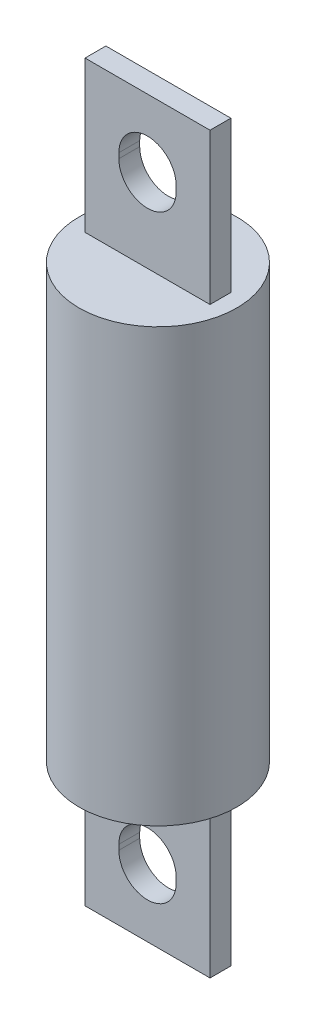
ISO-10303-21;
HEADER;
FILE_DESCRIPTION(('STEP AP214'),'2;1');
FILE_NAME('part.step','',(''),(''),'','','');
FILE_SCHEMA(('AUTOMOTIVE_DESIGN { 1 0 10303 214 1 1 1 1 }'));
ENDSEC;
DATA;
#1=APPLICATION_CONTEXT('core data for automotive mechanical design processes');
#2=APPLICATION_PROTOCOL_DEFINITION('international standard','automotive_design',2000,#1);
#3=PRODUCT_CONTEXT('',#1,'mechanical');
#4=PRODUCT('Part','Part','',(#3));
#5=PRODUCT_RELATED_PRODUCT_CATEGORY('part','',(#4));
#6=PRODUCT_DEFINITION_FORMATION('','',#4);
#7=PRODUCT_DEFINITION_CONTEXT('part definition',#1,'design');
#8=PRODUCT_DEFINITION('design','',#6,#7);
#9=PRODUCT_DEFINITION_SHAPE('','',#8);
#10=(LENGTH_UNIT() NAMED_UNIT(*) SI_UNIT(.MILLI.,.METRE.));
#11=(NAMED_UNIT(*) PLANE_ANGLE_UNIT() SI_UNIT($,.RADIAN.));
#12=(NAMED_UNIT(*) SI_UNIT($,.STERADIAN.) SOLID_ANGLE_UNIT());
#13=UNCERTAINTY_MEASURE_WITH_UNIT(LENGTH_MEASURE(1.E-05),#10,'distance_accuracy_value','');
#14=(GEOMETRIC_REPRESENTATION_CONTEXT(3) GLOBAL_UNCERTAINTY_ASSIGNED_CONTEXT((#13)) GLOBAL_UNIT_ASSIGNED_CONTEXT((#10,
#11,#12)) REPRESENTATION_CONTEXT('',''));
#15=CARTESIAN_POINT('',(0.,0.,0.));
#16=DIRECTION('',(0.,0.,1.));
#17=DIRECTION('',(1.,0.,0.));
#18=AXIS2_PLACEMENT_3D('',#15,#16,#17);
#19=CARTESIAN_POINT('',(-9.525,-23.0124,1.5875));
#20=DIRECTION('',(0.,0.,1.));
#21=DIRECTION('',(1.,0.,0.));
#22=AXIS2_PLACEMENT_3D('',#19,#20,#21);
#23=PLANE('',#22);
#24=DIRECTION('',(1.,0.,0.));
#25=VECTOR('',#24,1.);
#26=CARTESIAN_POINT('',(-9.525,0.,1.5875));
#27=LINE('',#26,#25);
#28=CARTESIAN_POINT('',(-9.525,0.,1.5875));
#29=VERTEX_POINT('',#28);
#30=CARTESIAN_POINT('',(9.525,0.,1.5875));
#31=VERTEX_POINT('',#30);
#32=EDGE_CURVE('E191',#29,#31,#27,.T.);
#33=ORIENTED_EDGE('',*,*,#32,.F.);
#34=DIRECTION('',(0.,1.,0.));
#35=VECTOR('',#34,1.);
#36=CARTESIAN_POINT('',(-9.525,-23.0124,1.5875));
#37=LINE('',#36,#35);
#38=CARTESIAN_POINT('',(-9.525,-23.0124,1.5875));
#39=VERTEX_POINT('',#38);
#40=EDGE_CURVE('E202',#39,#29,#37,.T.);
#41=ORIENTED_EDGE('',*,*,#40,.F.);
#42=DIRECTION('',(1.,0.,0.));
#43=VECTOR('',#42,1.);
#44=CARTESIAN_POINT('',(-9.525,-23.0124,1.5875));
#45=LINE('',#44,#43);
#46=CARTESIAN_POINT('',(9.525,-23.0124,1.5875));
#47=VERTEX_POINT('',#46);
#48=EDGE_CURVE('E178',#39,#47,#45,.T.);
#49=ORIENTED_EDGE('',*,*,#48,.T.);
#50=DIRECTION('',(0.,1.,0.));
#51=VECTOR('',#50,1.);
#52=CARTESIAN_POINT('',(9.525,-23.0124,1.5875));
#53=LINE('',#52,#51);
#54=EDGE_CURVE('E204',#47,#31,#53,.T.);
#55=ORIENTED_EDGE('',*,*,#54,.T.);
#56=EDGE_LOOP('',(#33,#41,#49,#55));
#57=FACE_BOUND('',#56,.T.);
#58=DIRECTION('',(0.,-1.,0.));
#59=VECTOR('',#58,1.);
#60=CARTESIAN_POINT('',(4.3688,-13.09751,1.5875));
#61=LINE('',#60,#59);
#62=CARTESIAN_POINT('',(4.3688,-12.3063,1.5875));
#63=VERTEX_POINT('',#62);
#64=CARTESIAN_POINT('',(4.3688,-13.09751,1.5875));
#65=VERTEX_POINT('',#64);
#66=EDGE_CURVE('E160',#63,#65,#61,.T.);
#67=ORIENTED_EDGE('',*,*,#66,.T.);
#68=CARTESIAN_POINT('',(0.,-13.09751,1.5875));
#69=DIRECTION('',(0.,0.,-1.));
#70=DIRECTION('',(1.,0.,0.));
#71=AXIS2_PLACEMENT_3D('',#68,#69,#70);
#72=CIRCLE('',#71,4.3688);
#73=CARTESIAN_POINT('',(-4.3688,-13.09751,1.5875));
#74=VERTEX_POINT('',#73);
#75=EDGE_CURVE('E50',#65,#74,#72,.T.);
#76=ORIENTED_EDGE('',*,*,#75,.T.);
#77=DIRECTION('',(0.,1.,0.));
#78=VECTOR('',#77,1.);
#79=CARTESIAN_POINT('',(-4.3688,-13.09751,1.5875));
#80=LINE('',#79,#78);
#81=CARTESIAN_POINT('',(-4.3688,-12.3063,1.5875));
#82=VERTEX_POINT('',#81);
#83=EDGE_CURVE('E165',#74,#82,#80,.T.);
#84=ORIENTED_EDGE('',*,*,#83,.T.);
#85=CARTESIAN_POINT('',(0.,-12.3063,1.5875));
#86=DIRECTION('',(0.,0.,-1.));
#87=DIRECTION('',(1.,0.,0.));
#88=AXIS2_PLACEMENT_3D('',#85,#86,#87);
#89=CIRCLE('',#88,4.3688);
#90=EDGE_CURVE('E151',#82,#63,#89,.T.);
#91=ORIENTED_EDGE('',*,*,#90,.T.);
#92=EDGE_LOOP('',(#67,#76,#84,#91));
#93=FACE_BOUND('',#92,.T.);
#94=ADVANCED_FACE('F35',(#57,#93),#23,.T.);
#95=CARTESIAN_POINT('',(-9.525,-23.0124,-1.5875));
#96=DIRECTION('',(0.,0.,-1.));
#97=DIRECTION('',(-1.,0.,0.));
#98=AXIS2_PLACEMENT_3D('',#95,#96,#97);
#99=PLANE('',#98);
#100=DIRECTION('',(-1.,0.,0.));
#101=VECTOR('',#100,1.);
#102=CARTESIAN_POINT('',(-9.525,0.,-1.5875));
#103=LINE('',#102,#101);
#104=CARTESIAN_POINT('',(9.525,0.,-1.5875));
#105=VERTEX_POINT('',#104);
#106=CARTESIAN_POINT('',(-9.525,0.,-1.5875));
#107=VERTEX_POINT('',#106);
#108=EDGE_CURVE('E179',#105,#107,#103,.T.);
#109=ORIENTED_EDGE('',*,*,#108,.F.);
#110=DIRECTION('',(0.,1.,0.));
#111=VECTOR('',#110,1.);
#112=CARTESIAN_POINT('',(9.525,-23.0124,-1.5875));
#113=LINE('',#112,#111);
#114=CARTESIAN_POINT('',(9.525,-23.0124,-1.5875));
#115=VERTEX_POINT('',#114);
#116=EDGE_CURVE('E188',#115,#105,#113,.T.);
#117=ORIENTED_EDGE('',*,*,#116,.F.);
#118=DIRECTION('',(-1.,0.,0.));
#119=VECTOR('',#118,1.);
#120=CARTESIAN_POINT('',(-9.525,-23.0124,-1.5875));
#121=LINE('',#120,#119);
#122=CARTESIAN_POINT('',(-9.525,-23.0124,-1.5875));
#123=VERTEX_POINT('',#122);
#124=EDGE_CURVE('E185',#115,#123,#121,.T.);
#125=ORIENTED_EDGE('',*,*,#124,.T.);
#126=DIRECTION('',(0.,1.,0.));
#127=VECTOR('',#126,1.);
#128=CARTESIAN_POINT('',(-9.525,-23.0124,-1.5875));
#129=LINE('',#128,#127);
#130=EDGE_CURVE('E200',#123,#107,#129,.T.);
#131=ORIENTED_EDGE('',*,*,#130,.T.);
#132=EDGE_LOOP('',(#109,#117,#125,#131));
#133=FACE_BOUND('',#132,.T.);
#134=DIRECTION('',(0.,-1.,0.));
#135=VECTOR('',#134,1.);
#136=CARTESIAN_POINT('',(-4.3688,-23.0124,-1.5875));
#137=LINE('',#136,#135);
#138=CARTESIAN_POINT('',(-4.3688,-12.3063,-1.58750000000001));
#139=VERTEX_POINT('',#138);
#140=CARTESIAN_POINT('',(-4.3688,-13.09751,-1.5875));
#141=VERTEX_POINT('',#140);
#142=EDGE_CURVE('E43',#139,#141,#137,.T.);
#143=ORIENTED_EDGE('',*,*,#142,.T.);
#144=CARTESIAN_POINT('',(0.,-13.09751,-1.5875));
#145=DIRECTION('',(0.,0.,-1.));
#146=DIRECTION('',(-1.,0.,0.));
#147=AXIS2_PLACEMENT_3D('',#144,#145,#146);
#148=CIRCLE('',#147,4.3688);
#149=CARTESIAN_POINT('',(4.3688,-13.09751,-1.5875));
#150=VERTEX_POINT('',#149);
#151=EDGE_CURVE('E11',#141,#150,#148,.F.);
#152=ORIENTED_EDGE('',*,*,#151,.T.);
#153=DIRECTION('',(0.,1.,0.));
#154=VECTOR('',#153,1.);
#155=CARTESIAN_POINT('',(4.3688,-23.0124,-1.5875));
#156=LINE('',#155,#154);
#157=CARTESIAN_POINT('',(4.3688,-12.3063,-1.5875));
#158=VERTEX_POINT('',#157);
#159=EDGE_CURVE('E276',#150,#158,#156,.T.);
#160=ORIENTED_EDGE('',*,*,#159,.T.);
#161=CARTESIAN_POINT('',(0.,-12.3063,-1.5875));
#162=DIRECTION('',(0.,0.,-1.));
#163=DIRECTION('',(-1.,0.,0.));
#164=AXIS2_PLACEMENT_3D('',#161,#162,#163);
#165=CIRCLE('',#164,4.3688);
#166=EDGE_CURVE('E154',#158,#139,#165,.F.);
#167=ORIENTED_EDGE('',*,*,#166,.T.);
#168=EDGE_LOOP('',(#143,#152,#160,#167));
#169=FACE_BOUND('',#168,.T.);
#170=ADVANCED_FACE('F282',(#133,#169),#99,.T.);
#171=CARTESIAN_POINT('',(0.,65.8876,0.));
#172=DIRECTION('',(0.,-1.,0.));
#173=DIRECTION('',(0.,0.,-1.));
#174=AXIS2_PLACEMENT_3D('',#171,#172,#173);
#175=CYLINDRICAL_SURFACE('',#174,12.0269);
#176=CARTESIAN_POINT('',(0.,65.8876,0.));
#177=DIRECTION('',(0.,1.,0.));
#178=DIRECTION('',(0.,0.,1.));
#179=AXIS2_PLACEMENT_3D('',#176,#177,#178);
#180=CIRCLE('',#179,12.0269);
#181=CARTESIAN_POINT('',(0.,65.8876,12.0269));
#182=VERTEX_POINT('',#181);
#183=EDGE_CURVE('E273',#182,#182,#180,.T.);
#184=ORIENTED_EDGE('',*,*,#183,.F.);
#185=EDGE_LOOP('',(#184));
#186=FACE_BOUND('',#185,.T.);
#187=CARTESIAN_POINT('',(0.,0.,0.));
#188=DIRECTION('',(0.,1.,0.));
#189=DIRECTION('',(0.,0.,1.));
#190=AXIS2_PLACEMENT_3D('',#187,#188,#189);
#191=CIRCLE('',#190,12.0269);
#192=CARTESIAN_POINT('',(0.,0.,12.0269));
#193=VERTEX_POINT('',#192);
#194=EDGE_CURVE('E272',#193,#193,#191,.T.);
#195=ORIENTED_EDGE('',*,*,#194,.T.);
#196=EDGE_LOOP('',(#195));
#197=FACE_BOUND('',#196,.T.);
#198=ADVANCED_FACE('F37',(#186,#197),#175,.T.);
#199=CARTESIAN_POINT('',(0.,65.8876,0.));
#200=DIRECTION('',(0.,1.,0.));
#201=DIRECTION('',(0.,0.,1.));
#202=AXIS2_PLACEMENT_3D('',#199,#200,#201);
#203=PLANE('',#202);
#204=DIRECTION('',(0.,0.,-1.));
#205=VECTOR('',#204,1.);
#206=CARTESIAN_POINT('',(9.525,65.8876,1.5875));
#207=LINE('',#206,#205);
#208=CARTESIAN_POINT('',(9.525,65.8876,1.5875));
#209=VERTEX_POINT('',#208);
#210=CARTESIAN_POINT('',(9.525,65.8876,-1.5875));
#211=VERTEX_POINT('',#210);
#212=EDGE_CURVE('E239',#209,#211,#207,.T.);
#213=ORIENTED_EDGE('',*,*,#212,.F.);
#214=DIRECTION('',(1.,0.,0.));
#215=VECTOR('',#214,1.);
#216=CARTESIAN_POINT('',(-9.525,65.8876,1.5875));
#217=LINE('',#216,#215);
#218=CARTESIAN_POINT('',(-9.525,65.8876,1.5875));
#219=VERTEX_POINT('',#218);
#220=EDGE_CURVE('E244',#219,#209,#217,.T.);
#221=ORIENTED_EDGE('',*,*,#220,.F.);
#222=DIRECTION('',(0.,0.,1.));
#223=VECTOR('',#222,1.);
#224=CARTESIAN_POINT('',(-9.525,65.8876,1.5875));
#225=LINE('',#224,#223);
#226=CARTESIAN_POINT('',(-9.525,65.8876,-1.5875));
#227=VERTEX_POINT('',#226);
#228=EDGE_CURVE('E256',#227,#219,#225,.T.);
#229=ORIENTED_EDGE('',*,*,#228,.F.);
#230=DIRECTION('',(-1.,0.,0.));
#231=VECTOR('',#230,1.);
#232=CARTESIAN_POINT('',(-9.525,65.8876,-1.5875));
#233=LINE('',#232,#231);
#234=EDGE_CURVE('E253',#211,#227,#233,.T.);
#235=ORIENTED_EDGE('',*,*,#234,.F.);
#236=EDGE_LOOP('',(#213,#221,#229,#235));
#237=FACE_BOUND('',#236,.T.);
#238=ORIENTED_EDGE('',*,*,#183,.T.);
#239=EDGE_LOOP('',(#238));
#240=FACE_BOUND('',#239,.T.);
#241=ADVANCED_FACE('F351',(#237,#240),#203,.T.);
#242=CARTESIAN_POINT('',(0.,0.,0.));
#243=DIRECTION('',(0.,1.,0.));
#244=DIRECTION('',(0.,0.,1.));
#245=AXIS2_PLACEMENT_3D('',#242,#243,#244);
#246=PLANE('',#245);
#247=ORIENTED_EDGE('',*,*,#32,.T.);
#248=DIRECTION('',(0.,0.,-1.));
#249=VECTOR('',#248,1.);
#250=CARTESIAN_POINT('',(9.525,0.,1.5875));
#251=LINE('',#250,#249);
#252=EDGE_CURVE('E172',#31,#105,#251,.T.);
#253=ORIENTED_EDGE('',*,*,#252,.T.);
#254=ORIENTED_EDGE('',*,*,#108,.T.);
#255=DIRECTION('',(0.,0.,1.));
#256=VECTOR('',#255,1.);
#257=CARTESIAN_POINT('',(-9.525,0.,1.5875));
#258=LINE('',#257,#256);
#259=EDGE_CURVE('E194',#107,#29,#258,.T.);
#260=ORIENTED_EDGE('',*,*,#259,.T.);
#261=EDGE_LOOP('',(#247,#253,#254,#260));
#262=FACE_BOUND('',#261,.T.);
#263=ORIENTED_EDGE('',*,*,#194,.F.);
#264=EDGE_LOOP('',(#263));
#265=FACE_BOUND('',#264,.T.);
#266=ADVANCED_FACE('F349',(#262,#265),#246,.F.);
#267=CARTESIAN_POINT('',(9.525,88.9,1.5875));
#268=DIRECTION('',(-1.,0.,0.));
#269=DIRECTION('',(0.,0.,1.));
#270=AXIS2_PLACEMENT_3D('',#267,#268,#269);
#271=PLANE('',#270);
#272=ORIENTED_EDGE('',*,*,#212,.T.);
#273=DIRECTION('',(0.,-1.,0.));
#274=VECTOR('',#273,1.);
#275=CARTESIAN_POINT('',(9.525,88.9,-1.5875));
#276=LINE('',#275,#274);
#277=CARTESIAN_POINT('',(9.525,88.9,-1.5875));
#278=VERTEX_POINT('',#277);
#279=EDGE_CURVE('E269',#278,#211,#276,.T.);
#280=ORIENTED_EDGE('',*,*,#279,.F.);
#281=DIRECTION('',(0.,0.,-1.));
#282=VECTOR('',#281,1.);
#283=CARTESIAN_POINT('',(9.525,88.9,1.5875));
#284=LINE('',#283,#282);
#285=CARTESIAN_POINT('',(9.525,88.9,1.5875));
#286=VERTEX_POINT('',#285);
#287=EDGE_CURVE('E240',#286,#278,#284,.T.);
#288=ORIENTED_EDGE('',*,*,#287,.F.);
#289=DIRECTION('',(0.,-1.,0.));
#290=VECTOR('',#289,1.);
#291=CARTESIAN_POINT('',(9.525,88.9,1.5875));
#292=LINE('',#291,#290);
#293=EDGE_CURVE('E250',#286,#209,#292,.T.);
#294=ORIENTED_EDGE('',*,*,#293,.T.);
#295=EDGE_LOOP('',(#272,#280,#288,#294));
#296=FACE_BOUND('',#295,.T.);
#297=ADVANCED_FACE('F345',(#296),#271,.F.);
#298=CARTESIAN_POINT('',(-9.525,88.9,-1.5875));
#299=DIRECTION('',(0.,0.,1.));
#300=DIRECTION('',(1.,0.,0.));
#301=AXIS2_PLACEMENT_3D('',#298,#299,#300);
#302=PLANE('',#301);
#303=DIRECTION('',(0.,1.,0.));
#304=VECTOR('',#303,1.);
#305=CARTESIAN_POINT('',(4.3688,88.9,-1.5875));
#306=LINE('',#305,#304);
#307=CARTESIAN_POINT('',(4.3688,78.1939,-1.58750000000001));
#308=VERTEX_POINT('',#307);
#309=CARTESIAN_POINT('',(4.3688,78.98511,-1.5875));
#310=VERTEX_POINT('',#309);
#311=EDGE_CURVE('E233',#308,#310,#306,.T.);
#312=ORIENTED_EDGE('',*,*,#311,.T.);
#313=CARTESIAN_POINT('',(0.,78.98511,-1.5875));
#314=DIRECTION('',(0.,0.,1.));
#315=DIRECTION('',(1.,0.,0.));
#316=AXIS2_PLACEMENT_3D('',#313,#314,#315);
#317=CIRCLE('',#316,4.3688);
#318=CARTESIAN_POINT('',(-4.3688,78.98511,-1.5875));
#319=VERTEX_POINT('',#318);
#320=EDGE_CURVE('E236',#310,#319,#317,.T.);
#321=ORIENTED_EDGE('',*,*,#320,.T.);
#322=DIRECTION('',(0.,-1.,0.));
#323=VECTOR('',#322,1.);
#324=CARTESIAN_POINT('',(-4.3688,88.9,-1.5875));
#325=LINE('',#324,#323);
#326=CARTESIAN_POINT('',(-4.3688,78.1939,-1.5875));
#327=VERTEX_POINT('',#326);
#328=EDGE_CURVE('E221',#319,#327,#325,.T.);
#329=ORIENTED_EDGE('',*,*,#328,.T.);
#330=CARTESIAN_POINT('',(0.,78.1939,-1.5875));
#331=DIRECTION('',(0.,0.,1.));
#332=DIRECTION('',(1.,0.,0.));
#333=AXIS2_PLACEMENT_3D('',#330,#331,#332);
#334=CIRCLE('',#333,4.3688);
#335=EDGE_CURVE('E230',#327,#308,#334,.T.);
#336=ORIENTED_EDGE('',*,*,#335,.T.);
#337=EDGE_LOOP('',(#312,#321,#329,#336));
#338=FACE_BOUND('',#337,.T.);
#339=ORIENTED_EDGE('',*,*,#234,.T.);
#340=DIRECTION('',(0.,-1.,0.));
#341=VECTOR('',#340,1.);
#342=CARTESIAN_POINT('',(-9.525,88.9,-1.5875));
#343=LINE('',#342,#341);
#344=CARTESIAN_POINT('',(-9.525,88.9,-1.5875));
#345=VERTEX_POINT('',#344);
#346=EDGE_CURVE('E266',#345,#227,#343,.T.);
#347=ORIENTED_EDGE('',*,*,#346,.F.);
#348=DIRECTION('',(-1.,0.,0.));
#349=VECTOR('',#348,1.);
#350=CARTESIAN_POINT('',(-9.525,88.9,-1.5875));
#351=LINE('',#350,#349);
#352=EDGE_CURVE('E243',#278,#345,#351,.T.);
#353=ORIENTED_EDGE('',*,*,#352,.F.);
#354=ORIENTED_EDGE('',*,*,#279,.T.);
#355=EDGE_LOOP('',(#339,#347,#353,#354));
#356=FACE_BOUND('',#355,.T.);
#357=ADVANCED_FACE('F341',(#338,#356),#302,.F.);
#358=CARTESIAN_POINT('',(-9.525,88.9,1.5875));
#359=DIRECTION('',(1.,0.,0.));
#360=DIRECTION('',(0.,0.,-1.));
#361=AXIS2_PLACEMENT_3D('',#358,#359,#360);
#362=PLANE('',#361);
#363=ORIENTED_EDGE('',*,*,#228,.T.);
#364=DIRECTION('',(0.,-1.,0.));
#365=VECTOR('',#364,1.);
#366=CARTESIAN_POINT('',(-9.525,88.9,1.5875));
#367=LINE('',#366,#365);
#368=CARTESIAN_POINT('',(-9.525,88.9,1.5875));
#369=VERTEX_POINT('',#368);
#370=EDGE_CURVE('E263',#369,#219,#367,.T.);
#371=ORIENTED_EDGE('',*,*,#370,.F.);
#372=DIRECTION('',(0.,0.,1.));
#373=VECTOR('',#372,1.);
#374=CARTESIAN_POINT('',(-9.525,88.9,1.5875));
#375=LINE('',#374,#373);
#376=EDGE_CURVE('E246',#345,#369,#375,.T.);
#377=ORIENTED_EDGE('',*,*,#376,.F.);
#378=ORIENTED_EDGE('',*,*,#346,.T.);
#379=EDGE_LOOP('',(#363,#371,#377,#378));
#380=FACE_BOUND('',#379,.T.);
#381=ADVANCED_FACE('F337',(#380),#362,.F.);
#382=CARTESIAN_POINT('',(-9.525,88.9,1.5875));
#383=DIRECTION('',(0.,0.,-1.));
#384=DIRECTION('',(-1.,0.,0.));
#385=AXIS2_PLACEMENT_3D('',#382,#383,#384);
#386=PLANE('',#385);
#387=DIRECTION('',(0.,-1.,0.));
#388=VECTOR('',#387,1.);
#389=CARTESIAN_POINT('',(-4.3688,78.98511,1.5875));
#390=LINE('',#389,#388);
#391=CARTESIAN_POINT('',(-4.3688,78.98511,1.5875));
#392=VERTEX_POINT('',#391);
#393=CARTESIAN_POINT('',(-4.3688,78.1939,1.5875));
#394=VERTEX_POINT('',#393);
#395=EDGE_CURVE('E209',#392,#394,#390,.T.);
#396=ORIENTED_EDGE('',*,*,#395,.F.);
#397=CARTESIAN_POINT('',(0.,78.98511,1.5875));
#398=DIRECTION('',(0.,0.,1.));
#399=DIRECTION('',(1.,0.,0.));
#400=AXIS2_PLACEMENT_3D('',#397,#398,#399);
#401=CIRCLE('',#400,4.3688);
#402=CARTESIAN_POINT('',(4.3688,78.98511,1.5875));
#403=VERTEX_POINT('',#402);
#404=EDGE_CURVE('E207',#403,#392,#401,.T.);
#405=ORIENTED_EDGE('',*,*,#404,.F.);
#406=DIRECTION('',(0.,1.,0.));
#407=VECTOR('',#406,1.);
#408=CARTESIAN_POINT('',(4.3688,78.98511,1.5875));
#409=LINE('',#408,#407);
#410=CARTESIAN_POINT('',(4.3688,78.1939,1.5875));
#411=VERTEX_POINT('',#410);
#412=EDGE_CURVE('E215',#411,#403,#409,.T.);
#413=ORIENTED_EDGE('',*,*,#412,.F.);
#414=CARTESIAN_POINT('',(0.,78.1939,1.5875));
#415=DIRECTION('',(0.,0.,1.));
#416=DIRECTION('',(1.,0.,0.));
#417=AXIS2_PLACEMENT_3D('',#414,#415,#416);
#418=CIRCLE('',#417,4.3688);
#419=EDGE_CURVE('E212',#394,#411,#418,.T.);
#420=ORIENTED_EDGE('',*,*,#419,.F.);
#421=EDGE_LOOP('',(#396,#405,#413,#420));
#422=FACE_BOUND('',#421,.T.);
#423=ORIENTED_EDGE('',*,*,#220,.T.);
#424=ORIENTED_EDGE('',*,*,#293,.F.);
#425=DIRECTION('',(1.,0.,0.));
#426=VECTOR('',#425,1.);
#427=CARTESIAN_POINT('',(-9.525,88.9,1.5875));
#428=LINE('',#427,#426);
#429=EDGE_CURVE('E248',#369,#286,#428,.T.);
#430=ORIENTED_EDGE('',*,*,#429,.F.);
#431=ORIENTED_EDGE('',*,*,#370,.T.);
#432=EDGE_LOOP('',(#423,#424,#430,#431));
#433=FACE_BOUND('',#432,.T.);
#434=ADVANCED_FACE('F333',(#422,#433),#386,.F.);
#435=CARTESIAN_POINT('',(0.,88.9,0.));
#436=DIRECTION('',(0.,-1.,0.));
#437=DIRECTION('',(0.,0.,-1.));
#438=AXIS2_PLACEMENT_3D('',#435,#436,#437);
#439=PLANE('',#438);
#440=ORIENTED_EDGE('',*,*,#287,.T.);
#441=ORIENTED_EDGE('',*,*,#352,.T.);
#442=ORIENTED_EDGE('',*,*,#376,.T.);
#443=ORIENTED_EDGE('',*,*,#429,.T.);
#444=EDGE_LOOP('',(#440,#441,#442,#443));
#445=FACE_BOUND('',#444,.T.);
#446=ADVANCED_FACE('F329',(#445),#439,.F.);
#447=CARTESIAN_POINT('',(0.,78.98511,-12.0269));
#448=DIRECTION('',(0.,0.,1.));
#449=DIRECTION('',(1.,0.,0.));
#450=AXIS2_PLACEMENT_3D('',#447,#448,#449);
#451=CYLINDRICAL_SURFACE('',#450,4.3688);
#452=DIRECTION('',(0.,0.,1.));
#453=VECTOR('',#452,1.);
#454=CARTESIAN_POINT('',(4.3688,78.98511,-12.0269));
#455=LINE('',#454,#453);
#456=EDGE_CURVE('E219',#310,#403,#455,.T.);
#457=ORIENTED_EDGE('',*,*,#456,.T.);
#458=ORIENTED_EDGE('',*,*,#404,.T.);
#459=DIRECTION('',(0.,0.,1.));
#460=VECTOR('',#459,1.);
#461=CARTESIAN_POINT('',(-4.3688,78.98511,-12.0269));
#462=LINE('',#461,#460);
#463=EDGE_CURVE('E218',#319,#392,#462,.T.);
#464=ORIENTED_EDGE('',*,*,#463,.F.);
#465=ORIENTED_EDGE('',*,*,#320,.F.);
#466=EDGE_LOOP('',(#457,#458,#464,#465));
#467=FACE_BOUND('',#466,.T.);
#468=ADVANCED_FACE('F319',(#467),#451,.F.);
#469=CARTESIAN_POINT('',(4.3688,78.98511,-12.0269));
#470=DIRECTION('',(1.,0.,0.));
#471=DIRECTION('',(0.,0.,-1.));
#472=AXIS2_PLACEMENT_3D('',#469,#470,#471);
#473=PLANE('',#472);
#474=DIRECTION('',(0.,0.,1.));
#475=VECTOR('',#474,1.);
#476=CARTESIAN_POINT('',(4.3688,78.1939,-12.0269));
#477=LINE('',#476,#475);
#478=EDGE_CURVE('E222',#308,#411,#477,.T.);
#479=ORIENTED_EDGE('',*,*,#478,.T.);
#480=ORIENTED_EDGE('',*,*,#412,.T.);
#481=ORIENTED_EDGE('',*,*,#456,.F.);
#482=ORIENTED_EDGE('',*,*,#311,.F.);
#483=EDGE_LOOP('',(#479,#480,#481,#482));
#484=FACE_BOUND('',#483,.T.);
#485=ADVANCED_FACE('F315',(#484),#473,.F.);
#486=CARTESIAN_POINT('',(0.,78.1939,-12.0269));
#487=DIRECTION('',(0.,0.,1.));
#488=DIRECTION('',(1.,0.,0.));
#489=AXIS2_PLACEMENT_3D('',#486,#487,#488);
#490=CYLINDRICAL_SURFACE('',#489,4.3688);
#491=DIRECTION('',(0.,0.,1.));
#492=VECTOR('',#491,1.);
#493=CARTESIAN_POINT('',(-4.3688,78.1939,-12.0269));
#494=LINE('',#493,#492);
#495=EDGE_CURVE('E224',#327,#394,#494,.T.);
#496=ORIENTED_EDGE('',*,*,#495,.T.);
#497=ORIENTED_EDGE('',*,*,#419,.T.);
#498=ORIENTED_EDGE('',*,*,#478,.F.);
#499=ORIENTED_EDGE('',*,*,#335,.F.);
#500=EDGE_LOOP('',(#496,#497,#498,#499));
#501=FACE_BOUND('',#500,.T.);
#502=ADVANCED_FACE('F318',(#501),#490,.F.);
#503=CARTESIAN_POINT('',(-4.3688,78.98511,-12.0269));
#504=DIRECTION('',(-1.,0.,0.));
#505=DIRECTION('',(0.,0.,1.));
#506=AXIS2_PLACEMENT_3D('',#503,#504,#505);
#507=PLANE('',#506);
#508=ORIENTED_EDGE('',*,*,#463,.T.);
#509=ORIENTED_EDGE('',*,*,#395,.T.);
#510=ORIENTED_EDGE('',*,*,#495,.F.);
#511=ORIENTED_EDGE('',*,*,#328,.F.);
#512=EDGE_LOOP('',(#508,#509,#510,#511));
#513=FACE_BOUND('',#512,.T.);
#514=ADVANCED_FACE('F313',(#513),#507,.F.);
#515=CARTESIAN_POINT('',(9.525,-23.0124,1.5875));
#516=DIRECTION('',(1.,0.,0.));
#517=DIRECTION('',(0.,0.,-1.));
#518=AXIS2_PLACEMENT_3D('',#515,#516,#517);
#519=PLANE('',#518);
#520=ORIENTED_EDGE('',*,*,#252,.F.);
#521=ORIENTED_EDGE('',*,*,#54,.F.);
#522=DIRECTION('',(0.,0.,-1.));
#523=VECTOR('',#522,1.);
#524=CARTESIAN_POINT('',(9.525,-23.0124,1.5875));
#525=LINE('',#524,#523);
#526=EDGE_CURVE('E175',#47,#115,#525,.T.);
#527=ORIENTED_EDGE('',*,*,#526,.T.);
#528=ORIENTED_EDGE('',*,*,#116,.T.);
#529=EDGE_LOOP('',(#520,#521,#527,#528));
#530=FACE_BOUND('',#529,.T.);
#531=ADVANCED_FACE('F310',(#530),#519,.T.);
#532=CARTESIAN_POINT('',(-9.525,-23.0124,1.5875));
#533=DIRECTION('',(-1.,0.,0.));
#534=DIRECTION('',(0.,0.,1.));
#535=AXIS2_PLACEMENT_3D('',#532,#533,#534);
#536=PLANE('',#535);
#537=ORIENTED_EDGE('',*,*,#259,.F.);
#538=ORIENTED_EDGE('',*,*,#130,.F.);
#539=DIRECTION('',(0.,0.,1.));
#540=VECTOR('',#539,1.);
#541=CARTESIAN_POINT('',(-9.525,-23.0124,1.5875));
#542=LINE('',#541,#540);
#543=EDGE_CURVE('E182',#123,#39,#542,.T.);
#544=ORIENTED_EDGE('',*,*,#543,.T.);
#545=ORIENTED_EDGE('',*,*,#40,.T.);
#546=EDGE_LOOP('',(#537,#538,#544,#545));
#547=FACE_BOUND('',#546,.T.);
#548=ADVANCED_FACE('F295',(#547),#536,.T.);
#549=CARTESIAN_POINT('',(0.,-23.0124,0.));
#550=DIRECTION('',(0.,1.,0.));
#551=DIRECTION('',(0.,0.,-1.));
#552=AXIS2_PLACEMENT_3D('',#549,#550,#551);
#553=PLANE('',#552);
#554=ORIENTED_EDGE('',*,*,#526,.F.);
#555=ORIENTED_EDGE('',*,*,#48,.F.);
#556=ORIENTED_EDGE('',*,*,#543,.F.);
#557=ORIENTED_EDGE('',*,*,#124,.F.);
#558=EDGE_LOOP('',(#554,#555,#556,#557));
#559=FACE_BOUND('',#558,.T.);
#560=ADVANCED_FACE('F288',(#559),#553,.F.);
#561=CARTESIAN_POINT('',(0.,-13.09751,-12.0269));
#562=DIRECTION('',(0.,0.,1.));
#563=DIRECTION('',(1.,0.,0.));
#564=AXIS2_PLACEMENT_3D('',#561,#562,#563);
#565=CYLINDRICAL_SURFACE('',#564,4.3688);
#566=DIRECTION('',(0.,0.,1.));
#567=VECTOR('',#566,1.);
#568=CARTESIAN_POINT('',(-4.3688,-13.09751,-12.0269));
#569=LINE('',#568,#567);
#570=EDGE_CURVE('E170',#141,#74,#569,.T.);
#571=ORIENTED_EDGE('',*,*,#570,.T.);
#572=ORIENTED_EDGE('',*,*,#75,.F.);
#573=DIRECTION('',(0.,0.,1.));
#574=VECTOR('',#573,1.);
#575=CARTESIAN_POINT('',(4.3688,-13.09751,-12.0269));
#576=LINE('',#575,#574);
#577=EDGE_CURVE('E157',#150,#65,#576,.T.);
#578=ORIENTED_EDGE('',*,*,#577,.F.);
#579=ORIENTED_EDGE('',*,*,#151,.F.);
#580=EDGE_LOOP('',(#571,#572,#578,#579));
#581=FACE_BOUND('',#580,.T.);
#582=ADVANCED_FACE('F286',(#581),#565,.F.);
#583=CARTESIAN_POINT('',(-4.3688,-13.09751,-12.0269));
#584=DIRECTION('',(1.,0.,0.));
#585=DIRECTION('',(0.,0.,-1.));
#586=AXIS2_PLACEMENT_3D('',#583,#584,#585);
#587=PLANE('',#586);
#588=DIRECTION('',(0.,0.,1.));
#589=VECTOR('',#588,1.);
#590=CARTESIAN_POINT('',(-4.3688,-12.3063,-12.0269));
#591=LINE('',#590,#589);
#592=EDGE_CURVE('E156',#139,#82,#591,.T.);
#593=ORIENTED_EDGE('',*,*,#592,.T.);
#594=ORIENTED_EDGE('',*,*,#83,.F.);
#595=ORIENTED_EDGE('',*,*,#570,.F.);
#596=ORIENTED_EDGE('',*,*,#142,.F.);
#597=EDGE_LOOP('',(#593,#594,#595,#596));
#598=FACE_BOUND('',#597,.T.);
#599=ADVANCED_FACE('F285',(#598),#587,.T.);
#600=CARTESIAN_POINT('',(0.,-12.3063,-12.0269));
#601=DIRECTION('',(0.,0.,1.));
#602=DIRECTION('',(1.,0.,0.));
#603=AXIS2_PLACEMENT_3D('',#600,#601,#602);
#604=CYLINDRICAL_SURFACE('',#603,4.3688);
#605=DIRECTION('',(0.,0.,1.));
#606=VECTOR('',#605,1.);
#607=CARTESIAN_POINT('',(4.3688,-12.3063,-12.0269));
#608=LINE('',#607,#606);
#609=EDGE_CURVE('E58',#158,#63,#608,.T.);
#610=ORIENTED_EDGE('',*,*,#609,.T.);
#611=ORIENTED_EDGE('',*,*,#90,.F.);
#612=ORIENTED_EDGE('',*,*,#592,.F.);
#613=ORIENTED_EDGE('',*,*,#166,.F.);
#614=EDGE_LOOP('',(#610,#611,#612,#613));
#615=FACE_BOUND('',#614,.T.);
#616=ADVANCED_FACE('F148',(#615),#604,.F.);
#617=CARTESIAN_POINT('',(4.3688,-13.09751,-12.0269));
#618=DIRECTION('',(-1.,0.,0.));
#619=DIRECTION('',(0.,0.,1.));
#620=AXIS2_PLACEMENT_3D('',#617,#618,#619);
#621=PLANE('',#620);
#622=ORIENTED_EDGE('',*,*,#577,.T.);
#623=ORIENTED_EDGE('',*,*,#66,.F.);
#624=ORIENTED_EDGE('',*,*,#609,.F.);
#625=ORIENTED_EDGE('',*,*,#159,.F.);
#626=EDGE_LOOP('',(#622,#623,#624,#625));
#627=FACE_BOUND('',#626,.T.);
#628=ADVANCED_FACE('F161',(#627),#621,.T.);
#629=CLOSED_SHELL('',(#94,#170,#198,#241,#266,#297,#357,#381,#434,#446,#468,#485,#502,#514,#531,
#548,#560,#582,#599,#616,#628));
#630=MANIFOLD_SOLID_BREP('B2',#629);
#631=ADVANCED_BREP_SHAPE_REPRESENTATION('',(#18,#630),#14);
#632=SHAPE_DEFINITION_REPRESENTATION(#9,#631);
ENDSEC;
END-ISO-10303-21;
